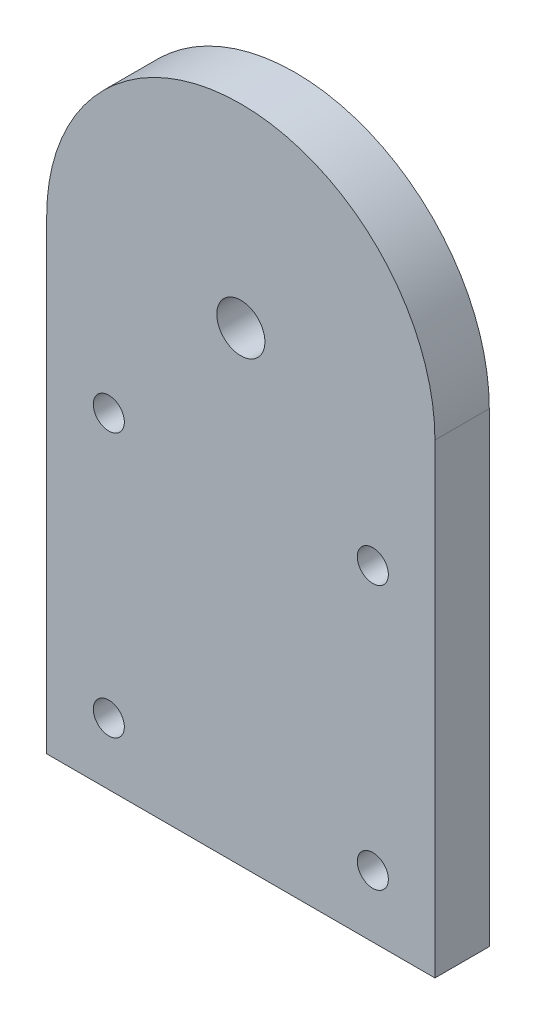
ISO-10303-21;
HEADER;
FILE_DESCRIPTION(('STEP AP214'),'2;1');
FILE_NAME('part.step','',(''),(''),'','','');
FILE_SCHEMA(('AUTOMOTIVE_DESIGN { 1 0 10303 214 1 1 1 1 }'));
ENDSEC;
DATA;
#1=APPLICATION_CONTEXT('core data for automotive mechanical design processes');
#2=APPLICATION_PROTOCOL_DEFINITION('international standard','automotive_design',2000,#1);
#3=PRODUCT_CONTEXT('',#1,'mechanical');
#4=PRODUCT('Part','Part','',(#3));
#5=PRODUCT_RELATED_PRODUCT_CATEGORY('part','',(#4));
#6=PRODUCT_DEFINITION_FORMATION('','',#4);
#7=PRODUCT_DEFINITION_CONTEXT('part definition',#1,'design');
#8=PRODUCT_DEFINITION('design','',#6,#7);
#9=PRODUCT_DEFINITION_SHAPE('','',#8);
#10=(LENGTH_UNIT() NAMED_UNIT(*) SI_UNIT(.MILLI.,.METRE.));
#11=(NAMED_UNIT(*) PLANE_ANGLE_UNIT() SI_UNIT($,.RADIAN.));
#12=(NAMED_UNIT(*) SI_UNIT($,.STERADIAN.) SOLID_ANGLE_UNIT());
#13=UNCERTAINTY_MEASURE_WITH_UNIT(LENGTH_MEASURE(1.E-05),#10,'distance_accuracy_value','');
#14=(GEOMETRIC_REPRESENTATION_CONTEXT(3) GLOBAL_UNCERTAINTY_ASSIGNED_CONTEXT((#13)) GLOBAL_UNIT_ASSIGNED_CONTEXT((#10,
#11,#12)) REPRESENTATION_CONTEXT('',''));
#15=CARTESIAN_POINT('',(0.,0.,0.));
#16=DIRECTION('',(0.,0.,1.));
#17=DIRECTION('',(1.,0.,0.));
#18=AXIS2_PLACEMENT_3D('',#15,#16,#17);
#19=CARTESIAN_POINT('',(0.,0.,0.));
#20=DIRECTION('',(0.,0.,1.));
#21=DIRECTION('',(1.,0.,0.));
#22=AXIS2_PLACEMENT_3D('',#19,#20,#21);
#23=PLANE('',#22);
#24=CARTESIAN_POINT('',(0.,0.,0.));
#25=DIRECTION('',(0.,0.,1.));
#26=DIRECTION('',(1.,0.,0.));
#27=AXIS2_PLACEMENT_3D('',#24,#25,#26);
#28=CIRCLE('',#27,25.);
#29=CARTESIAN_POINT('',(25.,0.,0.));
#30=VERTEX_POINT('',#29);
#31=CARTESIAN_POINT('',(-25.,0.,0.));
#32=VERTEX_POINT('',#31);
#33=EDGE_CURVE('E106',#30,#32,#28,.T.);
#34=ORIENTED_EDGE('',*,*,#33,.F.);
#35=DIRECTION('',(0.,1.,0.));
#36=VECTOR('',#35,1.);
#37=CARTESIAN_POINT('',(25.,0.,0.));
#38=LINE('',#37,#36);
#39=CARTESIAN_POINT('',(25.,-60.,0.));
#40=VERTEX_POINT('',#39);
#41=EDGE_CURVE('E77',#40,#30,#38,.T.);
#42=ORIENTED_EDGE('',*,*,#41,.F.);
#43=DIRECTION('',(1.,0.,0.));
#44=VECTOR('',#43,1.);
#45=CARTESIAN_POINT('',(-25.,-60.,0.));
#46=LINE('',#45,#44);
#47=CARTESIAN_POINT('',(-25.,-60.,0.));
#48=VERTEX_POINT('',#47);
#49=EDGE_CURVE('E71',#48,#40,#46,.T.);
#50=ORIENTED_EDGE('',*,*,#49,.F.);
#51=DIRECTION('',(0.,-1.,0.));
#52=VECTOR('',#51,1.);
#53=CARTESIAN_POINT('',(-25.,0.,0.));
#54=LINE('',#53,#52);
#55=EDGE_CURVE('E97',#32,#48,#54,.T.);
#56=ORIENTED_EDGE('',*,*,#55,.F.);
#57=EDGE_LOOP('',(#34,#42,#50,#56));
#58=FACE_BOUND('',#57,.T.);
#59=CARTESIAN_POINT('',(-17.,-18.,0.));
#60=DIRECTION('',(0.,0.,1.));
#61=DIRECTION('',(1.,0.,0.));
#62=AXIS2_PLACEMENT_3D('',#59,#60,#61);
#63=CIRCLE('',#62,2.);
#64=CARTESIAN_POINT('',(-15.,-18.,0.));
#65=VERTEX_POINT('',#64);
#66=EDGE_CURVE('E125',#65,#65,#63,.T.);
#67=ORIENTED_EDGE('',*,*,#66,.T.);
#68=EDGE_LOOP('',(#67));
#69=FACE_BOUND('',#68,.T.);
#70=CARTESIAN_POINT('',(-17.,-52.,0.));
#71=DIRECTION('',(0.,0.,1.));
#72=DIRECTION('',(-1.,0.,0.));
#73=AXIS2_PLACEMENT_3D('',#70,#71,#72);
#74=CIRCLE('',#73,2.);
#75=CARTESIAN_POINT('',(-19.,-52.,0.));
#76=VERTEX_POINT('',#75);
#77=EDGE_CURVE('E129',#76,#76,#74,.T.);
#78=ORIENTED_EDGE('',*,*,#77,.T.);
#79=EDGE_LOOP('',(#78));
#80=FACE_BOUND('',#79,.T.);
#81=CARTESIAN_POINT('',(17.,-18.,0.));
#82=DIRECTION('',(0.,0.,1.));
#83=DIRECTION('',(-1.,0.,0.));
#84=AXIS2_PLACEMENT_3D('',#81,#82,#83);
#85=CIRCLE('',#84,2.00000000000001);
#86=CARTESIAN_POINT('',(15.,-18.,0.));
#87=VERTEX_POINT('',#86);
#88=EDGE_CURVE('E133',#87,#87,#85,.T.);
#89=ORIENTED_EDGE('',*,*,#88,.T.);
#90=EDGE_LOOP('',(#89));
#91=FACE_BOUND('',#90,.T.);
#92=CARTESIAN_POINT('',(17.,-52.,0.));
#93=DIRECTION('',(0.,0.,1.));
#94=DIRECTION('',(1.,0.,0.));
#95=AXIS2_PLACEMENT_3D('',#92,#93,#94);
#96=CIRCLE('',#95,2.);
#97=CARTESIAN_POINT('',(19.,-52.,0.));
#98=VERTEX_POINT('',#97);
#99=EDGE_CURVE('E137',#98,#98,#96,.T.);
#100=ORIENTED_EDGE('',*,*,#99,.T.);
#101=EDGE_LOOP('',(#100));
#102=FACE_BOUND('',#101,.T.);
#103=CARTESIAN_POINT('',(0.,0.,0.));
#104=DIRECTION('',(0.,0.,1.));
#105=DIRECTION('',(1.,0.,0.));
#106=AXIS2_PLACEMENT_3D('',#103,#104,#105);
#107=CIRCLE('',#106,11.);
#108=CARTESIAN_POINT('',(11.,0.,0.));
#109=VERTEX_POINT('',#108);
#110=EDGE_CURVE('E11',#109,#109,#107,.F.);
#111=ORIENTED_EDGE('',*,*,#110,.F.);
#112=EDGE_LOOP('',(#111));
#113=FACE_BOUND('',#112,.T.);
#114=ADVANCED_FACE('F36',(#58,#69,#80,#91,#102,#113),#23,.F.);
#115=CARTESIAN_POINT('',(0.,0.,7.));
#116=DIRECTION('',(0.,0.,1.));
#117=DIRECTION('',(1.,0.,0.));
#118=AXIS2_PLACEMENT_3D('',#115,#116,#117);
#119=PLANE('',#118);
#120=CARTESIAN_POINT('',(17.,-18.,7.));
#121=DIRECTION('',(0.,0.,1.));
#122=DIRECTION('',(-1.,0.,0.));
#123=AXIS2_PLACEMENT_3D('',#120,#121,#122);
#124=CIRCLE('',#123,2.00000000000001);
#125=CARTESIAN_POINT('',(15.,-18.,7.));
#126=VERTEX_POINT('',#125);
#127=EDGE_CURVE('E288',#126,#126,#124,.T.);
#128=ORIENTED_EDGE('',*,*,#127,.F.);
#129=EDGE_LOOP('',(#128));
#130=FACE_BOUND('',#129,.T.);
#131=CARTESIAN_POINT('',(-17.,-18.,7.));
#132=DIRECTION('',(0.,0.,1.));
#133=DIRECTION('',(1.,0.,0.));
#134=AXIS2_PLACEMENT_3D('',#131,#132,#133);
#135=CIRCLE('',#134,2.);
#136=CARTESIAN_POINT('',(-15.,-18.,7.));
#137=VERTEX_POINT('',#136);
#138=EDGE_CURVE('E291',#137,#137,#135,.T.);
#139=ORIENTED_EDGE('',*,*,#138,.F.);
#140=EDGE_LOOP('',(#139));
#141=FACE_BOUND('',#140,.T.);
#142=CARTESIAN_POINT('',(0.,0.,7.));
#143=DIRECTION('',(0.,0.,1.));
#144=DIRECTION('',(1.,0.,0.));
#145=AXIS2_PLACEMENT_3D('',#142,#143,#144);
#146=CIRCLE('',#145,25.);
#147=CARTESIAN_POINT('',(25.,0.,7.));
#148=VERTEX_POINT('',#147);
#149=CARTESIAN_POINT('',(-25.,0.,7.));
#150=VERTEX_POINT('',#149);
#151=EDGE_CURVE('E91',#148,#150,#146,.T.);
#152=ORIENTED_EDGE('',*,*,#151,.T.);
#153=DIRECTION('',(0.,-1.,0.));
#154=VECTOR('',#153,1.);
#155=CARTESIAN_POINT('',(-25.,0.,7.));
#156=LINE('',#155,#154);
#157=CARTESIAN_POINT('',(-25.,-60.,7.));
#158=VERTEX_POINT('',#157);
#159=EDGE_CURVE('E85',#150,#158,#156,.T.);
#160=ORIENTED_EDGE('',*,*,#159,.T.);
#161=DIRECTION('',(1.,0.,0.));
#162=VECTOR('',#161,1.);
#163=CARTESIAN_POINT('',(-25.,-60.,7.));
#164=LINE('',#163,#162);
#165=CARTESIAN_POINT('',(25.,-60.,7.));
#166=VERTEX_POINT('',#165);
#167=EDGE_CURVE('E89',#158,#166,#164,.T.);
#168=ORIENTED_EDGE('',*,*,#167,.T.);
#169=DIRECTION('',(0.,1.,0.));
#170=VECTOR('',#169,1.);
#171=CARTESIAN_POINT('',(25.,0.,7.));
#172=LINE('',#171,#170);
#173=EDGE_CURVE('E54',#166,#148,#172,.T.);
#174=ORIENTED_EDGE('',*,*,#173,.T.);
#175=EDGE_LOOP('',(#152,#160,#168,#174));
#176=FACE_BOUND('',#175,.T.);
#177=CARTESIAN_POINT('',(0.,0.,7.));
#178=DIRECTION('',(0.,0.,1.));
#179=DIRECTION('',(1.,0.,0.));
#180=AXIS2_PLACEMENT_3D('',#177,#178,#179);
#181=CIRCLE('',#180,3.1);
#182=CARTESIAN_POINT('',(3.1,0.,7.));
#183=VERTEX_POINT('',#182);
#184=EDGE_CURVE('E110',#183,#183,#181,.T.);
#185=ORIENTED_EDGE('',*,*,#184,.F.);
#186=EDGE_LOOP('',(#185));
#187=FACE_BOUND('',#186,.T.);
#188=CARTESIAN_POINT('',(-17.,-52.,7.));
#189=DIRECTION('',(0.,0.,1.));
#190=DIRECTION('',(-1.,0.,0.));
#191=AXIS2_PLACEMENT_3D('',#188,#189,#190);
#192=CIRCLE('',#191,2.);
#193=CARTESIAN_POINT('',(-19.,-52.,7.));
#194=VERTEX_POINT('',#193);
#195=EDGE_CURVE('E299',#194,#194,#192,.T.);
#196=ORIENTED_EDGE('',*,*,#195,.F.);
#197=EDGE_LOOP('',(#196));
#198=FACE_BOUND('',#197,.T.);
#199=CARTESIAN_POINT('',(17.,-52.,7.));
#200=DIRECTION('',(0.,0.,1.));
#201=DIRECTION('',(1.,0.,0.));
#202=AXIS2_PLACEMENT_3D('',#199,#200,#201);
#203=CIRCLE('',#202,2.);
#204=CARTESIAN_POINT('',(19.,-52.,7.));
#205=VERTEX_POINT('',#204);
#206=EDGE_CURVE('E311',#205,#205,#203,.T.);
#207=ORIENTED_EDGE('',*,*,#206,.F.);
#208=EDGE_LOOP('',(#207));
#209=FACE_BOUND('',#208,.T.);
#210=ADVANCED_FACE('F86',(#130,#141,#176,#187,#198,#209),#119,.T.);
#211=CARTESIAN_POINT('',(0.,0.,7.));
#212=DIRECTION('',(0.,0.,-1.));
#213=DIRECTION('',(-1.,0.,0.));
#214=AXIS2_PLACEMENT_3D('',#211,#212,#213);
#215=CYLINDRICAL_SURFACE('',#214,25.);
#216=ORIENTED_EDGE('',*,*,#33,.T.);
#217=DIRECTION('',(0.,0.,-1.));
#218=VECTOR('',#217,1.);
#219=CARTESIAN_POINT('',(-25.,0.,7.));
#220=LINE('',#219,#218);
#221=EDGE_CURVE('E46',#150,#32,#220,.T.);
#222=ORIENTED_EDGE('',*,*,#221,.F.);
#223=ORIENTED_EDGE('',*,*,#151,.F.);
#224=DIRECTION('',(0.,0.,-1.));
#225=VECTOR('',#224,1.);
#226=CARTESIAN_POINT('',(25.,0.,7.));
#227=LINE('',#226,#225);
#228=EDGE_CURVE('E102',#148,#30,#227,.T.);
#229=ORIENTED_EDGE('',*,*,#228,.T.);
#230=EDGE_LOOP('',(#216,#222,#223,#229));
#231=FACE_BOUND('',#230,.T.);
#232=ADVANCED_FACE('F38',(#231),#215,.T.);
#233=CARTESIAN_POINT('',(-25.,0.,7.));
#234=DIRECTION('',(1.,0.,0.));
#235=DIRECTION('',(0.,1.,0.));
#236=AXIS2_PLACEMENT_3D('',#233,#234,#235);
#237=PLANE('',#236);
#238=ORIENTED_EDGE('',*,*,#55,.T.);
#239=DIRECTION('',(0.,0.,-1.));
#240=VECTOR('',#239,1.);
#241=CARTESIAN_POINT('',(-25.,-60.,7.));
#242=LINE('',#241,#240);
#243=EDGE_CURVE('E95',#158,#48,#242,.T.);
#244=ORIENTED_EDGE('',*,*,#243,.F.);
#245=ORIENTED_EDGE('',*,*,#159,.F.);
#246=ORIENTED_EDGE('',*,*,#221,.T.);
#247=EDGE_LOOP('',(#238,#244,#245,#246));
#248=FACE_BOUND('',#247,.T.);
#249=ADVANCED_FACE('F96',(#248),#237,.F.);
#250=CARTESIAN_POINT('',(-25.,-60.,7.));
#251=DIRECTION('',(0.,1.,0.));
#252=DIRECTION('',(0.,0.,1.));
#253=AXIS2_PLACEMENT_3D('',#250,#251,#252);
#254=PLANE('',#253);
#255=ORIENTED_EDGE('',*,*,#49,.T.);
#256=DIRECTION('',(0.,0.,-1.));
#257=VECTOR('',#256,1.);
#258=CARTESIAN_POINT('',(25.,-60.,7.));
#259=LINE('',#258,#257);
#260=EDGE_CURVE('E98',#166,#40,#259,.T.);
#261=ORIENTED_EDGE('',*,*,#260,.F.);
#262=ORIENTED_EDGE('',*,*,#167,.F.);
#263=ORIENTED_EDGE('',*,*,#243,.T.);
#264=EDGE_LOOP('',(#255,#261,#262,#263));
#265=FACE_BOUND('',#264,.T.);
#266=ADVANCED_FACE('F100',(#265),#254,.F.);
#267=CARTESIAN_POINT('',(25.,0.,7.));
#268=DIRECTION('',(-1.,0.,0.));
#269=DIRECTION('',(0.,-1.,0.));
#270=AXIS2_PLACEMENT_3D('',#267,#268,#269);
#271=PLANE('',#270);
#272=ORIENTED_EDGE('',*,*,#41,.T.);
#273=ORIENTED_EDGE('',*,*,#228,.F.);
#274=ORIENTED_EDGE('',*,*,#173,.F.);
#275=ORIENTED_EDGE('',*,*,#260,.T.);
#276=EDGE_LOOP('',(#272,#273,#274,#275));
#277=FACE_BOUND('',#276,.T.);
#278=ADVANCED_FACE('F179',(#277),#271,.F.);
#279=CARTESIAN_POINT('',(0.,0.,7.));
#280=DIRECTION('',(0.,0.,-1.));
#281=DIRECTION('',(-1.,0.,0.));
#282=AXIS2_PLACEMENT_3D('',#279,#280,#281);
#283=CYLINDRICAL_SURFACE('',#282,3.1);
#284=ORIENTED_EDGE('',*,*,#184,.T.);
#285=EDGE_LOOP('',(#284));
#286=FACE_BOUND('',#285,.T.);
#287=CARTESIAN_POINT('',(0.,0.,-7.));
#288=DIRECTION('',(0.,0.,-1.));
#289=DIRECTION('',(-1.,0.,0.));
#290=AXIS2_PLACEMENT_3D('',#287,#288,#289);
#291=CIRCLE('',#290,3.1);
#292=CARTESIAN_POINT('',(-3.1,0.,-7.));
#293=VERTEX_POINT('',#292);
#294=EDGE_CURVE('E308',#293,#293,#291,.T.);
#295=ORIENTED_EDGE('',*,*,#294,.T.);
#296=EDGE_LOOP('',(#295));
#297=FACE_BOUND('',#296,.T.);
#298=ADVANCED_FACE('F175',(#286,#297),#283,.F.);
#299=CARTESIAN_POINT('',(-17.,-18.,7.));
#300=DIRECTION('',(0.,0.,-1.));
#301=DIRECTION('',(-1.,0.,0.));
#302=AXIS2_PLACEMENT_3D('',#299,#300,#301);
#303=CYLINDRICAL_SURFACE('',#302,2.);
#304=ORIENTED_EDGE('',*,*,#138,.T.);
#305=EDGE_LOOP('',(#304));
#306=FACE_BOUND('',#305,.T.);
#307=ORIENTED_EDGE('',*,*,#66,.F.);
#308=EDGE_LOOP('',(#307));
#309=FACE_BOUND('',#308,.T.);
#310=ADVANCED_FACE('F171',(#306,#309),#303,.F.);
#311=CARTESIAN_POINT('',(-17.,-52.,7.));
#312=DIRECTION('',(0.,0.,-1.));
#313=DIRECTION('',(-1.,0.,0.));
#314=AXIS2_PLACEMENT_3D('',#311,#312,#313);
#315=CYLINDRICAL_SURFACE('',#314,2.);
#316=ORIENTED_EDGE('',*,*,#195,.T.);
#317=EDGE_LOOP('',(#316));
#318=FACE_BOUND('',#317,.T.);
#319=ORIENTED_EDGE('',*,*,#77,.F.);
#320=EDGE_LOOP('',(#319));
#321=FACE_BOUND('',#320,.T.);
#322=ADVANCED_FACE('F167',(#318,#321),#315,.F.);
#323=CARTESIAN_POINT('',(17.,-18.,7.));
#324=DIRECTION('',(0.,0.,-1.));
#325=DIRECTION('',(-1.,0.,0.));
#326=AXIS2_PLACEMENT_3D('',#323,#324,#325);
#327=CYLINDRICAL_SURFACE('',#326,2.00000000000001);
#328=ORIENTED_EDGE('',*,*,#127,.T.);
#329=EDGE_LOOP('',(#328));
#330=FACE_BOUND('',#329,.T.);
#331=ORIENTED_EDGE('',*,*,#88,.F.);
#332=EDGE_LOOP('',(#331));
#333=FACE_BOUND('',#332,.T.);
#334=ADVANCED_FACE('F163',(#330,#333),#327,.F.);
#335=CARTESIAN_POINT('',(17.,-52.,7.));
#336=DIRECTION('',(0.,0.,-1.));
#337=DIRECTION('',(-1.,0.,0.));
#338=AXIS2_PLACEMENT_3D('',#335,#336,#337);
#339=CYLINDRICAL_SURFACE('',#338,2.);
#340=ORIENTED_EDGE('',*,*,#206,.T.);
#341=EDGE_LOOP('',(#340));
#342=FACE_BOUND('',#341,.T.);
#343=ORIENTED_EDGE('',*,*,#99,.F.);
#344=EDGE_LOOP('',(#343));
#345=FACE_BOUND('',#344,.T.);
#346=ADVANCED_FACE('F156',(#342,#345),#339,.F.);
#347=CARTESIAN_POINT('',(0.,0.,-7.));
#348=DIRECTION('',(0.,0.,-1.));
#349=DIRECTION('',(-1.,0.,0.));
#350=AXIS2_PLACEMENT_3D('',#347,#348,#349);
#351=PLANE('',#350);
#352=CARTESIAN_POINT('',(0.,0.,-7.));
#353=DIRECTION('',(0.,0.,-1.));
#354=DIRECTION('',(-1.,0.,0.));
#355=AXIS2_PLACEMENT_3D('',#352,#353,#354);
#356=CIRCLE('',#355,5.95);
#357=CARTESIAN_POINT('',(-5.95,0.,-7.));
#358=VERTEX_POINT('',#357);
#359=EDGE_CURVE('E306',#358,#358,#356,.T.);
#360=ORIENTED_EDGE('',*,*,#359,.T.);
#361=EDGE_LOOP('',(#360));
#362=FACE_BOUND('',#361,.T.);
#363=ORIENTED_EDGE('',*,*,#294,.F.);
#364=EDGE_LOOP('',(#363));
#365=FACE_BOUND('',#364,.T.);
#366=ADVANCED_FACE('F153',(#362,#365),#351,.T.);
#367=CARTESIAN_POINT('',(0.,0.,-7.));
#368=DIRECTION('',(0.,0.,1.));
#369=DIRECTION('',(1.,0.,0.));
#370=AXIS2_PLACEMENT_3D('',#367,#368,#369);
#371=CYLINDRICAL_SURFACE('',#370,5.95);
#372=CARTESIAN_POINT('',(0.,0.,-5.));
#373=DIRECTION('',(0.,0.,-1.));
#374=DIRECTION('',(-1.,0.,0.));
#375=AXIS2_PLACEMENT_3D('',#372,#373,#374);
#376=CIRCLE('',#375,5.95);
#377=CARTESIAN_POINT('',(-5.95,0.,-5.));
#378=VERTEX_POINT('',#377);
#379=EDGE_CURVE('E331',#378,#378,#376,.T.);
#380=ORIENTED_EDGE('',*,*,#379,.T.);
#381=EDGE_LOOP('',(#380));
#382=FACE_BOUND('',#381,.T.);
#383=ORIENTED_EDGE('',*,*,#359,.F.);
#384=EDGE_LOOP('',(#383));
#385=FACE_BOUND('',#384,.T.);
#386=ADVANCED_FACE('F148',(#382,#385),#371,.T.);
#387=CARTESIAN_POINT('',(0.,0.,-5.));
#388=DIRECTION('',(0.,0.,-1.));
#389=DIRECTION('',(-1.,0.,0.));
#390=AXIS2_PLACEMENT_3D('',#387,#388,#389);
#391=PLANE('',#390);
#392=CARTESIAN_POINT('',(0.,0.,-5.));
#393=DIRECTION('',(0.,0.,-1.));
#394=DIRECTION('',(-1.,0.,0.));
#395=AXIS2_PLACEMENT_3D('',#392,#393,#394);
#396=CIRCLE('',#395,11.);
#397=CARTESIAN_POINT('',(-11.,0.,-5.));
#398=VERTEX_POINT('',#397);
#399=EDGE_CURVE('E314',#398,#398,#396,.T.);
#400=ORIENTED_EDGE('',*,*,#399,.T.);
#401=EDGE_LOOP('',(#400));
#402=FACE_BOUND('',#401,.T.);
#403=ORIENTED_EDGE('',*,*,#379,.F.);
#404=EDGE_LOOP('',(#403));
#405=FACE_BOUND('',#404,.T.);
#406=ADVANCED_FACE('F142',(#402,#405),#391,.T.);
#407=CARTESIAN_POINT('',(0.,0.,-5.));
#408=DIRECTION('',(0.,0.,1.));
#409=DIRECTION('',(1.,0.,0.));
#410=AXIS2_PLACEMENT_3D('',#407,#408,#409);
#411=CYLINDRICAL_SURFACE('',#410,11.);
#412=ORIENTED_EDGE('',*,*,#399,.F.);
#413=EDGE_LOOP('',(#412));
#414=FACE_BOUND('',#413,.T.);
#415=ORIENTED_EDGE('',*,*,#110,.T.);
#416=EDGE_LOOP('',(#415));
#417=FACE_BOUND('',#416,.T.);
#418=ADVANCED_FACE('F140',(#414,#417),#411,.T.);
#419=CLOSED_SHELL('',(#114,#210,#232,#249,#266,#278,#298,#310,#322,#334,#346,#366,#386,#406,#418));
#420=MANIFOLD_SOLID_BREP('B2',#419);
#421=ADVANCED_BREP_SHAPE_REPRESENTATION('',(#18,#420),#14);
#422=SHAPE_DEFINITION_REPRESENTATION(#9,#421);
ENDSEC;
END-ISO-10303-21;
